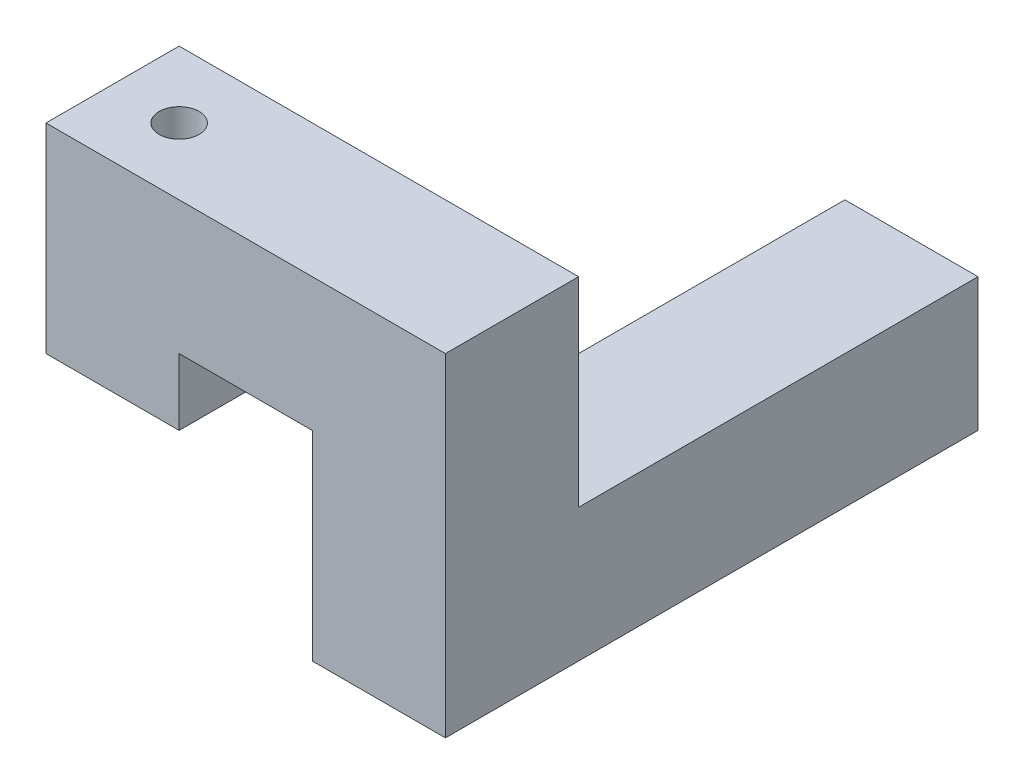
ISO-10303-21;
HEADER;
FILE_DESCRIPTION(('STEP AP214'),'2;1');
FILE_NAME('part.step','',(''),(''),'','','');
FILE_SCHEMA(('AUTOMOTIVE_DESIGN { 1 0 10303 214 1 1 1 1 }'));
ENDSEC;
DATA;
#1=APPLICATION_CONTEXT('core data for automotive mechanical design processes');
#2=APPLICATION_PROTOCOL_DEFINITION('international standard','automotive_design',2000,#1);
#3=PRODUCT_CONTEXT('',#1,'mechanical');
#4=PRODUCT('Part','Part','',(#3));
#5=PRODUCT_RELATED_PRODUCT_CATEGORY('part','',(#4));
#6=PRODUCT_DEFINITION_FORMATION('','',#4);
#7=PRODUCT_DEFINITION_CONTEXT('part definition',#1,'design');
#8=PRODUCT_DEFINITION('design','',#6,#7);
#9=PRODUCT_DEFINITION_SHAPE('','',#8);
#10=(LENGTH_UNIT() NAMED_UNIT(*) SI_UNIT(.MILLI.,.METRE.));
#11=(NAMED_UNIT(*) PLANE_ANGLE_UNIT() SI_UNIT($,.RADIAN.));
#12=(NAMED_UNIT(*) SI_UNIT($,.STERADIAN.) SOLID_ANGLE_UNIT());
#13=UNCERTAINTY_MEASURE_WITH_UNIT(LENGTH_MEASURE(1.E-05),#10,'distance_accuracy_value','');
#14=(GEOMETRIC_REPRESENTATION_CONTEXT(3) GLOBAL_UNCERTAINTY_ASSIGNED_CONTEXT((#13)) GLOBAL_UNIT_ASSIGNED_CONTEXT((#10,
#11,#12)) REPRESENTATION_CONTEXT('',''));
#15=CARTESIAN_POINT('',(0.,0.,0.));
#16=DIRECTION('',(0.,0.,1.));
#17=DIRECTION('',(1.,0.,0.));
#18=AXIS2_PLACEMENT_3D('',#15,#16,#17);
#19=CARTESIAN_POINT('',(-10.,30.,-9.99999999999999));
#20=DIRECTION('',(0.,0.,1.));
#21=DIRECTION('',(1.,0.,0.));
#22=AXIS2_PLACEMENT_3D('',#19,#20,#21);
#23=PLANE('',#22);
#24=DIRECTION('',(1.,0.,0.));
#25=VECTOR('',#24,1.);
#26=CARTESIAN_POINT('',(30.,0.,-9.99999999999999));
#27=LINE('',#26,#25);
#28=CARTESIAN_POINT('',(30.,0.,-9.99999999999999));
#29=VERTEX_POINT('',#28);
#30=CARTESIAN_POINT('',(50.,0.,-9.99999999999999));
#31=VERTEX_POINT('',#30);
#32=EDGE_CURVE('E51',#29,#31,#27,.T.);
#33=ORIENTED_EDGE('',*,*,#32,.F.);
#34=DIRECTION('',(0.,1.,0.));
#35=VECTOR('',#34,1.);
#36=CARTESIAN_POINT('',(30.,-20.,-9.99999999999999));
#37=LINE('',#36,#35);
#38=CARTESIAN_POINT('',(30.,10.,-9.99999999999999));
#39=VERTEX_POINT('',#38);
#40=EDGE_CURVE('E137',#29,#39,#37,.T.);
#41=ORIENTED_EDGE('',*,*,#40,.T.);
#42=DIRECTION('',(-1.,0.,0.));
#43=VECTOR('',#42,1.);
#44=CARTESIAN_POINT('',(50.,10.,-9.99999999999999));
#45=LINE('',#44,#43);
#46=CARTESIAN_POINT('',(9.99999999999999,10.,-9.99999999999999));
#47=VERTEX_POINT('',#46);
#48=EDGE_CURVE('E163',#39,#47,#45,.T.);
#49=ORIENTED_EDGE('',*,*,#48,.T.);
#50=DIRECTION('',(0.,-1.,0.));
#51=VECTOR('',#50,1.);
#52=CARTESIAN_POINT('',(9.99999999999999,30.,-9.99999999999999));
#53=LINE('',#52,#51);
#54=CARTESIAN_POINT('',(9.99999999999999,0.,-9.99999999999999));
#55=VERTEX_POINT('',#54);
#56=EDGE_CURVE('E11',#47,#55,#53,.T.);
#57=ORIENTED_EDGE('',*,*,#56,.T.);
#58=DIRECTION('',(-1.,0.,0.));
#59=VECTOR('',#58,1.);
#60=CARTESIAN_POINT('',(-10.,0.,-9.99999999999999));
#61=LINE('',#60,#59);
#62=CARTESIAN_POINT('',(-10.,0.,-9.99999999999999));
#63=VERTEX_POINT('',#62);
#64=EDGE_CURVE('E176',#55,#63,#61,.T.);
#65=ORIENTED_EDGE('',*,*,#64,.T.);
#66=DIRECTION('',(0.,-1.,0.));
#67=VECTOR('',#66,1.);
#68=CARTESIAN_POINT('',(-10.,30.,-9.99999999999999));
#69=LINE('',#68,#67);
#70=CARTESIAN_POINT('',(-10.,30.,-9.99999999999999));
#71=VERTEX_POINT('',#70);
#72=EDGE_CURVE('E44',#71,#63,#69,.T.);
#73=ORIENTED_EDGE('',*,*,#72,.F.);
#74=DIRECTION('',(-1.,0.,0.));
#75=VECTOR('',#74,1.);
#76=CARTESIAN_POINT('',(-10.,30.,-9.99999999999999));
#77=LINE('',#76,#75);
#78=CARTESIAN_POINT('',(50.,30.,-9.99999999999999));
#79=VERTEX_POINT('',#78);
#80=EDGE_CURVE('E166',#79,#71,#77,.T.);
#81=ORIENTED_EDGE('',*,*,#80,.F.);
#82=DIRECTION('',(0.,-1.,0.));
#83=VECTOR('',#82,1.);
#84=CARTESIAN_POINT('',(50.,30.,-9.99999999999999));
#85=LINE('',#84,#83);
#86=EDGE_CURVE('E154',#79,#31,#85,.T.);
#87=ORIENTED_EDGE('',*,*,#86,.T.);
#88=EDGE_LOOP('',(#33,#41,#49,#57,#65,#73,#81,#87));
#89=FACE_BOUND('',#88,.T.);
#90=ADVANCED_FACE('F36',(#89),#23,.F.);
#91=CARTESIAN_POINT('',(50.,10.,10.));
#92=DIRECTION('',(0.,1.,0.));
#93=DIRECTION('',(0.,0.,1.));
#94=AXIS2_PLACEMENT_3D('',#91,#92,#93);
#95=PLANE('',#94);
#96=DIRECTION('',(0.,0.,-1.));
#97=VECTOR('',#96,1.);
#98=CARTESIAN_POINT('',(30.,10.,10.));
#99=LINE('',#98,#97);
#100=CARTESIAN_POINT('',(30.,10.,10.));
#101=VERTEX_POINT('',#100);
#102=EDGE_CURVE('E138',#101,#39,#99,.T.);
#103=ORIENTED_EDGE('',*,*,#102,.F.);
#104=DIRECTION('',(-1.,0.,0.));
#105=VECTOR('',#104,1.);
#106=CARTESIAN_POINT('',(50.,10.,10.));
#107=LINE('',#106,#105);
#108=CARTESIAN_POINT('',(10.,10.,10.));
#109=VERTEX_POINT('',#108);
#110=EDGE_CURVE('E59',#101,#109,#107,.T.);
#111=ORIENTED_EDGE('',*,*,#110,.T.);
#112=DIRECTION('',(0.,0.,-1.));
#113=VECTOR('',#112,1.);
#114=CARTESIAN_POINT('',(10.,10.,10.));
#115=LINE('',#114,#113);
#116=EDGE_CURVE('E152',#109,#47,#115,.T.);
#117=ORIENTED_EDGE('',*,*,#116,.T.);
#118=ORIENTED_EDGE('',*,*,#48,.F.);
#119=EDGE_LOOP('',(#103,#111,#117,#118));
#120=FACE_BOUND('',#119,.T.);
#121=ADVANCED_FACE('F235',(#120),#95,.F.);
#122=CARTESIAN_POINT('',(9.99999999999999,30.,-9.99999999999999));
#123=DIRECTION('',(-1.,0.,0.));
#124=DIRECTION('',(0.,0.,1.));
#125=AXIS2_PLACEMENT_3D('',#122,#123,#124);
#126=PLANE('',#125);
#127=ORIENTED_EDGE('',*,*,#116,.F.);
#128=DIRECTION('',(0.,-1.,0.));
#129=VECTOR('',#128,1.);
#130=CARTESIAN_POINT('',(10.,30.,10.));
#131=LINE('',#130,#129);
#132=CARTESIAN_POINT('',(10.,0.,10.));
#133=VERTEX_POINT('',#132);
#134=EDGE_CURVE('E173',#109,#133,#131,.T.);
#135=ORIENTED_EDGE('',*,*,#134,.T.);
#136=DIRECTION('',(0.,0.,-1.));
#137=VECTOR('',#136,1.);
#138=CARTESIAN_POINT('',(9.99999999999999,0.,-9.99999999999999));
#139=LINE('',#138,#137);
#140=EDGE_CURVE('E165',#133,#55,#139,.T.);
#141=ORIENTED_EDGE('',*,*,#140,.T.);
#142=ORIENTED_EDGE('',*,*,#56,.F.);
#143=EDGE_LOOP('',(#127,#135,#141,#142));
#144=FACE_BOUND('',#143,.T.);
#145=ADVANCED_FACE('F38',(#144),#126,.F.);
#146=CARTESIAN_POINT('',(-10.,30.,-9.99999999999999));
#147=DIRECTION('',(1.,0.,0.));
#148=DIRECTION('',(0.,0.,-1.));
#149=AXIS2_PLACEMENT_3D('',#146,#147,#148);
#150=PLANE('',#149);
#151=DIRECTION('',(0.,0.,1.));
#152=VECTOR('',#151,1.);
#153=CARTESIAN_POINT('',(-10.,0.,-9.99999999999999));
#154=LINE('',#153,#152);
#155=CARTESIAN_POINT('',(-10.,0.,10.));
#156=VERTEX_POINT('',#155);
#157=EDGE_CURVE('E178',#63,#156,#154,.T.);
#158=ORIENTED_EDGE('',*,*,#157,.T.);
#159=DIRECTION('',(0.,-1.,0.));
#160=VECTOR('',#159,1.);
#161=CARTESIAN_POINT('',(-10.,30.,10.));
#162=LINE('',#161,#160);
#163=CARTESIAN_POINT('',(-10.,30.,10.));
#164=VERTEX_POINT('',#163);
#165=EDGE_CURVE('E183',#164,#156,#162,.T.);
#166=ORIENTED_EDGE('',*,*,#165,.F.);
#167=DIRECTION('',(0.,0.,1.));
#168=VECTOR('',#167,1.);
#169=CARTESIAN_POINT('',(-10.,30.,-9.99999999999999));
#170=LINE('',#169,#168);
#171=EDGE_CURVE('E168',#71,#164,#170,.T.);
#172=ORIENTED_EDGE('',*,*,#171,.F.);
#173=ORIENTED_EDGE('',*,*,#72,.T.);
#174=EDGE_LOOP('',(#158,#166,#172,#173));
#175=FACE_BOUND('',#174,.T.);
#176=ADVANCED_FACE('F190',(#175),#150,.F.);
#177=CARTESIAN_POINT('',(-10.,30.,10.));
#178=DIRECTION('',(0.,0.,-1.));
#179=DIRECTION('',(-1.,0.,0.));
#180=AXIS2_PLACEMENT_3D('',#177,#178,#179);
#181=PLANE('',#180);
#182=DIRECTION('',(1.,0.,0.));
#183=VECTOR('',#182,1.);
#184=CARTESIAN_POINT('',(-10.,0.,10.));
#185=LINE('',#184,#183);
#186=EDGE_CURVE('E169',#156,#133,#185,.T.);
#187=ORIENTED_EDGE('',*,*,#186,.T.);
#188=ORIENTED_EDGE('',*,*,#134,.F.);
#189=ORIENTED_EDGE('',*,*,#110,.F.);
#190=DIRECTION('',(0.,1.,0.));
#191=VECTOR('',#190,1.);
#192=CARTESIAN_POINT('',(30.,-20.,10.));
#193=LINE('',#192,#191);
#194=CARTESIAN_POINT('',(30.,-20.,10.));
#195=VERTEX_POINT('',#194);
#196=EDGE_CURVE('E150',#195,#101,#193,.T.);
#197=ORIENTED_EDGE('',*,*,#196,.F.);
#198=DIRECTION('',(-1.,0.,0.));
#199=VECTOR('',#198,1.);
#200=CARTESIAN_POINT('',(50.,-20.,10.));
#201=LINE('',#200,#199);
#202=CARTESIAN_POINT('',(50.,-20.,10.));
#203=VERTEX_POINT('',#202);
#204=EDGE_CURVE('E146',#203,#195,#201,.T.);
#205=ORIENTED_EDGE('',*,*,#204,.F.);
#206=DIRECTION('',(0.,-1.,0.));
#207=VECTOR('',#206,1.);
#208=CARTESIAN_POINT('',(50.,30.,10.));
#209=LINE('',#208,#207);
#210=CARTESIAN_POINT('',(50.,30.,10.));
#211=VERTEX_POINT('',#210);
#212=EDGE_CURVE('E159',#211,#203,#209,.T.);
#213=ORIENTED_EDGE('',*,*,#212,.F.);
#214=DIRECTION('',(1.,0.,0.));
#215=VECTOR('',#214,1.);
#216=CARTESIAN_POINT('',(-10.,30.,10.));
#217=LINE('',#216,#215);
#218=EDGE_CURVE('E171',#164,#211,#217,.T.);
#219=ORIENTED_EDGE('',*,*,#218,.F.);
#220=ORIENTED_EDGE('',*,*,#165,.T.);
#221=EDGE_LOOP('',(#187,#188,#189,#197,#205,#213,#219,#220));
#222=FACE_BOUND('',#221,.T.);
#223=ADVANCED_FACE('F199',(#222),#181,.F.);
#224=CARTESIAN_POINT('',(0.,30.,0.));
#225=DIRECTION('',(0.,1.,0.));
#226=DIRECTION('',(0.,0.,1.));
#227=AXIS2_PLACEMENT_3D('',#224,#225,#226);
#228=PLANE('',#227);
#229=CARTESIAN_POINT('',(0.,30.,0.));
#230=DIRECTION('',(0.,1.,0.));
#231=DIRECTION('',(0.,0.,1.));
#232=AXIS2_PLACEMENT_3D('',#229,#230,#231);
#233=CIRCLE('',#232,3.);
#234=CARTESIAN_POINT('',(0.,30.,3.));
#235=VERTEX_POINT('',#234);
#236=EDGE_CURVE('E212',#235,#235,#233,.T.);
#237=ORIENTED_EDGE('',*,*,#236,.F.);
#238=EDGE_LOOP('',(#237));
#239=FACE_BOUND('',#238,.T.);
#240=ORIENTED_EDGE('',*,*,#218,.T.);
#241=DIRECTION('',(0.,0.,-1.));
#242=VECTOR('',#241,1.);
#243=CARTESIAN_POINT('',(50.,30.,10.));
#244=LINE('',#243,#242);
#245=EDGE_CURVE('E156',#211,#79,#244,.T.);
#246=ORIENTED_EDGE('',*,*,#245,.T.);
#247=ORIENTED_EDGE('',*,*,#80,.T.);
#248=ORIENTED_EDGE('',*,*,#171,.T.);
#249=EDGE_LOOP('',(#240,#246,#247,#248));
#250=FACE_BOUND('',#249,.T.);
#251=ADVANCED_FACE('F205',(#239,#250),#228,.T.);
#252=CARTESIAN_POINT('',(0.,0.,0.));
#253=DIRECTION('',(0.,1.,0.));
#254=DIRECTION('',(0.,0.,1.));
#255=AXIS2_PLACEMENT_3D('',#252,#253,#254);
#256=PLANE('',#255);
#257=CARTESIAN_POINT('',(0.,0.,0.));
#258=DIRECTION('',(0.,-1.,0.));
#259=DIRECTION('',(0.,0.,-1.));
#260=AXIS2_PLACEMENT_3D('',#257,#258,#259);
#261=CIRCLE('',#260,3.);
#262=CARTESIAN_POINT('',(0.,0.,-3.));
#263=VERTEX_POINT('',#262);
#264=EDGE_CURVE('E214',#263,#263,#261,.T.);
#265=ORIENTED_EDGE('',*,*,#264,.F.);
#266=EDGE_LOOP('',(#265));
#267=FACE_BOUND('',#266,.T.);
#268=ORIENTED_EDGE('',*,*,#140,.F.);
#269=ORIENTED_EDGE('',*,*,#186,.F.);
#270=ORIENTED_EDGE('',*,*,#157,.F.);
#271=ORIENTED_EDGE('',*,*,#64,.F.);
#272=EDGE_LOOP('',(#268,#269,#270,#271));
#273=FACE_BOUND('',#272,.T.);
#274=ADVANCED_FACE('F196',(#267,#273),#256,.F.);
#275=CARTESIAN_POINT('',(50.,0.,0.));
#276=DIRECTION('',(-1.,0.,0.));
#277=DIRECTION('',(0.,0.,1.));
#278=AXIS2_PLACEMENT_3D('',#275,#276,#277);
#279=PLANE('',#278);
#280=ORIENTED_EDGE('',*,*,#212,.T.);
#281=DIRECTION('',(0.,0.,-1.));
#282=VECTOR('',#281,1.);
#283=CARTESIAN_POINT('',(50.,-20.,10.));
#284=LINE('',#283,#282);
#285=CARTESIAN_POINT('',(50.,-20.,-70.));
#286=VERTEX_POINT('',#285);
#287=EDGE_CURVE('E148',#203,#286,#284,.T.);
#288=ORIENTED_EDGE('',*,*,#287,.T.);
#289=DIRECTION('',(0.,-1.,0.));
#290=VECTOR('',#289,1.);
#291=CARTESIAN_POINT('',(50.,-20.,-70.));
#292=LINE('',#291,#290);
#293=CARTESIAN_POINT('',(50.,0.,-70.));
#294=VERTEX_POINT('',#293);
#295=EDGE_CURVE('E124',#294,#286,#292,.T.);
#296=ORIENTED_EDGE('',*,*,#295,.F.);
#297=DIRECTION('',(0.,0.,1.));
#298=VECTOR('',#297,1.);
#299=CARTESIAN_POINT('',(50.,0.,-70.));
#300=LINE('',#299,#298);
#301=EDGE_CURVE('E120',#294,#31,#300,.T.);
#302=ORIENTED_EDGE('',*,*,#301,.T.);
#303=ORIENTED_EDGE('',*,*,#86,.F.);
#304=ORIENTED_EDGE('',*,*,#245,.F.);
#305=EDGE_LOOP('',(#280,#288,#296,#302,#303,#304));
#306=FACE_BOUND('',#305,.T.);
#307=ADVANCED_FACE('F208',(#306),#279,.F.);
#308=CARTESIAN_POINT('',(30.,-20.,10.));
#309=DIRECTION('',(1.,0.,0.));
#310=DIRECTION('',(0.,0.,-1.));
#311=AXIS2_PLACEMENT_3D('',#308,#309,#310);
#312=PLANE('',#311);
#313=ORIENTED_EDGE('',*,*,#102,.T.);
#314=ORIENTED_EDGE('',*,*,#40,.F.);
#315=DIRECTION('',(0.,0.,1.));
#316=VECTOR('',#315,1.);
#317=CARTESIAN_POINT('',(30.,0.,-70.));
#318=LINE('',#317,#316);
#319=CARTESIAN_POINT('',(30.,0.,-70.));
#320=VERTEX_POINT('',#319);
#321=EDGE_CURVE('E118',#320,#29,#318,.T.);
#322=ORIENTED_EDGE('',*,*,#321,.F.);
#323=DIRECTION('',(0.,1.,0.));
#324=VECTOR('',#323,1.);
#325=CARTESIAN_POINT('',(30.,-20.,-70.));
#326=LINE('',#325,#324);
#327=CARTESIAN_POINT('',(30.,-20.,-70.));
#328=VERTEX_POINT('',#327);
#329=EDGE_CURVE('E125',#328,#320,#326,.T.);
#330=ORIENTED_EDGE('',*,*,#329,.F.);
#331=DIRECTION('',(0.,0.,-1.));
#332=VECTOR('',#331,1.);
#333=CARTESIAN_POINT('',(30.,-20.,10.));
#334=LINE('',#333,#332);
#335=EDGE_CURVE('E140',#195,#328,#334,.T.);
#336=ORIENTED_EDGE('',*,*,#335,.F.);
#337=ORIENTED_EDGE('',*,*,#196,.T.);
#338=EDGE_LOOP('',(#313,#314,#322,#330,#336,#337));
#339=FACE_BOUND('',#338,.T.);
#340=ADVANCED_FACE('F136',(#339),#312,.F.);
#341=CARTESIAN_POINT('',(0.,-20.,0.));
#342=DIRECTION('',(0.,-1.,0.));
#343=DIRECTION('',(0.,0.,-1.));
#344=AXIS2_PLACEMENT_3D('',#341,#342,#343);
#345=PLANE('',#344);
#346=ORIENTED_EDGE('',*,*,#335,.T.);
#347=DIRECTION('',(-1.,0.,0.));
#348=VECTOR('',#347,1.);
#349=CARTESIAN_POINT('',(30.,-20.,-70.));
#350=LINE('',#349,#348);
#351=EDGE_CURVE('E131',#286,#328,#350,.T.);
#352=ORIENTED_EDGE('',*,*,#351,.F.);
#353=ORIENTED_EDGE('',*,*,#287,.F.);
#354=ORIENTED_EDGE('',*,*,#204,.T.);
#355=EDGE_LOOP('',(#346,#352,#353,#354));
#356=FACE_BOUND('',#355,.T.);
#357=ADVANCED_FACE('F283',(#356),#345,.T.);
#358=CARTESIAN_POINT('',(30.,0.,-70.));
#359=DIRECTION('',(0.,-1.,0.));
#360=DIRECTION('',(0.,0.,-1.));
#361=AXIS2_PLACEMENT_3D('',#358,#359,#360);
#362=PLANE('',#361);
#363=ORIENTED_EDGE('',*,*,#32,.T.);
#364=ORIENTED_EDGE('',*,*,#301,.F.);
#365=DIRECTION('',(1.,0.,0.));
#366=VECTOR('',#365,1.);
#367=CARTESIAN_POINT('',(30.,0.,-70.));
#368=LINE('',#367,#366);
#369=EDGE_CURVE('E114',#320,#294,#368,.T.);
#370=ORIENTED_EDGE('',*,*,#369,.F.);
#371=ORIENTED_EDGE('',*,*,#321,.T.);
#372=EDGE_LOOP('',(#363,#364,#370,#371));
#373=FACE_BOUND('',#372,.T.);
#374=ADVANCED_FACE('F116',(#373),#362,.F.);
#375=CARTESIAN_POINT('',(0.,0.,-70.));
#376=DIRECTION('',(0.,0.,-1.));
#377=DIRECTION('',(-1.,0.,0.));
#378=AXIS2_PLACEMENT_3D('',#375,#376,#377);
#379=PLANE('',#378);
#380=ORIENTED_EDGE('',*,*,#329,.T.);
#381=ORIENTED_EDGE('',*,*,#369,.T.);
#382=ORIENTED_EDGE('',*,*,#295,.T.);
#383=ORIENTED_EDGE('',*,*,#351,.T.);
#384=EDGE_LOOP('',(#380,#381,#382,#383));
#385=FACE_BOUND('',#384,.T.);
#386=ADVANCED_FACE('F129',(#385),#379,.T.);
#387=CARTESIAN_POINT('',(0.,60.,0.));
#388=DIRECTION('',(0.,-1.,0.));
#389=DIRECTION('',(0.,0.,-1.));
#390=AXIS2_PLACEMENT_3D('',#387,#388,#389);
#391=CYLINDRICAL_SURFACE('',#390,3.);
#392=ORIENTED_EDGE('',*,*,#236,.T.);
#393=EDGE_LOOP('',(#392));
#394=FACE_BOUND('',#393,.T.);
#395=ORIENTED_EDGE('',*,*,#264,.T.);
#396=EDGE_LOOP('',(#395));
#397=FACE_BOUND('',#396,.T.);
#398=ADVANCED_FACE('F222',(#394,#397),#391,.F.);
#399=CLOSED_SHELL('',(#90,#121,#145,#176,#223,#251,#274,#307,#340,#357,#374,#386,#398));
#400=MANIFOLD_SOLID_BREP('B2',#399);
#401=ADVANCED_BREP_SHAPE_REPRESENTATION('',(#18,#400),#14);
#402=SHAPE_DEFINITION_REPRESENTATION(#9,#401);
ENDSEC;
END-ISO-10303-21;
